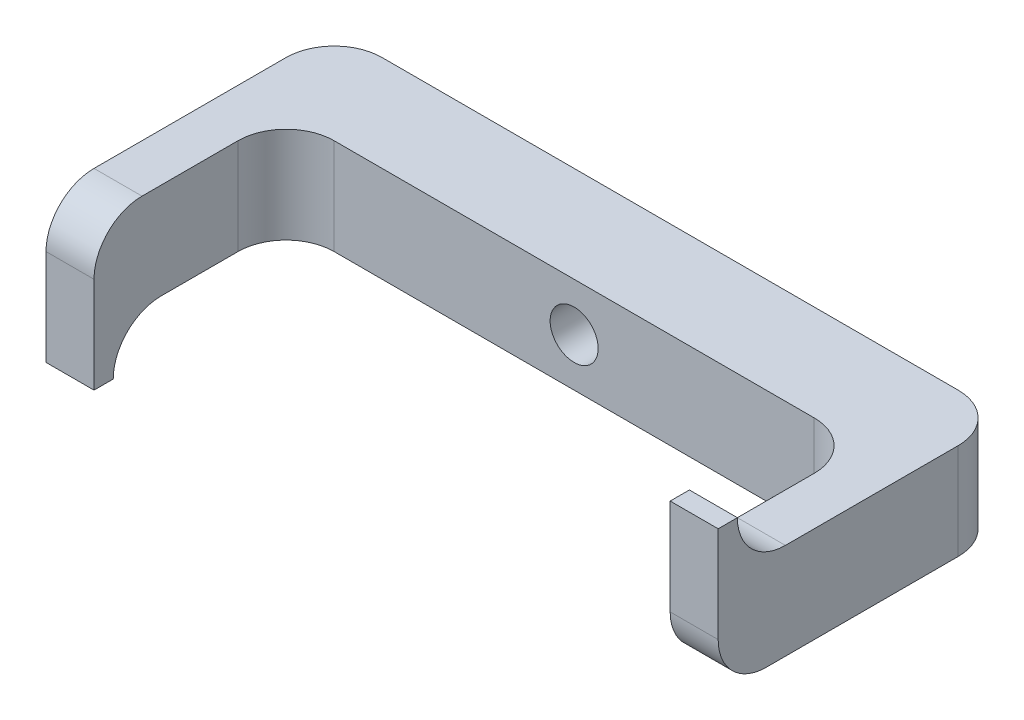
ISO-10303-21;
HEADER;
FILE_DESCRIPTION(('STEP AP214'),'2;1');
FILE_NAME('part.step','',(''),(''),'','','');
FILE_SCHEMA(('AUTOMOTIVE_DESIGN { 1 0 10303 214 1 1 1 1 }'));
ENDSEC;
DATA;
#1=APPLICATION_CONTEXT('core data for automotive mechanical design processes');
#2=APPLICATION_PROTOCOL_DEFINITION('international standard','automotive_design',2000,#1);
#3=PRODUCT_CONTEXT('',#1,'mechanical');
#4=PRODUCT('Part','Part','',(#3));
#5=PRODUCT_RELATED_PRODUCT_CATEGORY('part','',(#4));
#6=PRODUCT_DEFINITION_FORMATION('','',#4);
#7=PRODUCT_DEFINITION_CONTEXT('part definition',#1,'design');
#8=PRODUCT_DEFINITION('design','',#6,#7);
#9=PRODUCT_DEFINITION_SHAPE('','',#8);
#10=(LENGTH_UNIT() NAMED_UNIT(*) SI_UNIT(.MILLI.,.METRE.));
#11=(NAMED_UNIT(*) PLANE_ANGLE_UNIT() SI_UNIT($,.RADIAN.));
#12=(NAMED_UNIT(*) SI_UNIT($,.STERADIAN.) SOLID_ANGLE_UNIT());
#13=UNCERTAINTY_MEASURE_WITH_UNIT(LENGTH_MEASURE(1.E-05),#10,'distance_accuracy_value','');
#14=(GEOMETRIC_REPRESENTATION_CONTEXT(3) GLOBAL_UNCERTAINTY_ASSIGNED_CONTEXT((#13)) GLOBAL_UNIT_ASSIGNED_CONTEXT((#10,
#11,#12)) REPRESENTATION_CONTEXT('',''));
#15=CARTESIAN_POINT('',(0.,0.,0.));
#16=DIRECTION('',(0.,0.,1.));
#17=DIRECTION('',(1.,0.,0.));
#18=AXIS2_PLACEMENT_3D('',#15,#16,#17);
#19=CARTESIAN_POINT('',(-35.,5.,15.));
#20=DIRECTION('',(1.,0.,0.));
#21=DIRECTION('',(0.,0.,-1.));
#22=AXIS2_PLACEMENT_3D('',#19,#20,#21);
#23=PLANE('',#22);
#24=DIRECTION('',(0.,-1.,0.));
#25=VECTOR('',#24,1.);
#26=CARTESIAN_POINT('',(-35.,5.,15.));
#27=LINE('',#26,#25);
#28=CARTESIAN_POINT('',(-35.,0.,15.));
#29=VERTEX_POINT('',#28);
#30=CARTESIAN_POINT('',(-35.,-10.,15.));
#31=VERTEX_POINT('',#30);
#32=EDGE_CURVE('E279',#29,#31,#27,.T.);
#33=ORIENTED_EDGE('',*,*,#32,.F.);
#34=CARTESIAN_POINT('',(-35.,0.,10.));
#35=DIRECTION('',(1.,0.,0.));
#36=DIRECTION('',(0.,0.,-1.));
#37=AXIS2_PLACEMENT_3D('',#34,#35,#36);
#38=CIRCLE('',#37,5.);
#39=CARTESIAN_POINT('',(-35.,5.,10.));
#40=VERTEX_POINT('',#39);
#41=EDGE_CURVE('E320',#29,#40,#38,.F.);
#42=ORIENTED_EDGE('',*,*,#41,.T.);
#43=DIRECTION('',(0.,0.,1.));
#44=VECTOR('',#43,1.);
#45=CARTESIAN_POINT('',(-35.,5.,15.));
#46=LINE('',#45,#44);
#47=CARTESIAN_POINT('',(-35.,5.,-10.));
#48=VERTEX_POINT('',#47);
#49=EDGE_CURVE('E226',#48,#40,#46,.T.);
#50=ORIENTED_EDGE('',*,*,#49,.F.);
#51=DIRECTION('',(0.,-1.,0.));
#52=VECTOR('',#51,1.);
#53=CARTESIAN_POINT('',(-35.,5.,-10.));
#54=LINE('',#53,#52);
#55=CARTESIAN_POINT('',(-35.,-5.,-10.));
#56=VERTEX_POINT('',#55);
#57=EDGE_CURVE('E316',#48,#56,#54,.T.);
#58=ORIENTED_EDGE('',*,*,#57,.T.);
#59=DIRECTION('',(0.,0.,1.));
#60=VECTOR('',#59,1.);
#61=CARTESIAN_POINT('',(-35.,-5.,15.));
#62=LINE('',#61,#60);
#63=CARTESIAN_POINT('',(-35.,-5.,8.));
#64=VERTEX_POINT('',#63);
#65=EDGE_CURVE('E222',#56,#64,#62,.T.);
#66=ORIENTED_EDGE('',*,*,#65,.T.);
#67=CARTESIAN_POINT('',(-35.,-10.,8.));
#68=DIRECTION('',(1.,0.,0.));
#69=DIRECTION('',(0.,0.,-1.));
#70=AXIS2_PLACEMENT_3D('',#67,#68,#69);
#71=CIRCLE('',#70,5.);
#72=CARTESIAN_POINT('',(-35.,-10.,13.));
#73=VERTEX_POINT('',#72);
#74=EDGE_CURVE('E180',#64,#73,#71,.T.);
#75=ORIENTED_EDGE('',*,*,#74,.T.);
#76=DIRECTION('',(0.,0.,1.));
#77=VECTOR('',#76,1.);
#78=CARTESIAN_POINT('',(-35.,-10.,13.));
#79=LINE('',#78,#77);
#80=EDGE_CURVE('E206',#73,#31,#79,.T.);
#81=ORIENTED_EDGE('',*,*,#80,.T.);
#82=EDGE_LOOP('',(#33,#42,#50,#58,#66,#75,#81));
#83=FACE_BOUND('',#82,.T.);
#84=ADVANCED_FACE('F39',(#83),#23,.F.);
#85=CARTESIAN_POINT('',(-30.,5.,15.));
#86=DIRECTION('',(0.,0.,-1.));
#87=DIRECTION('',(-1.,0.,0.));
#88=AXIS2_PLACEMENT_3D('',#85,#86,#87);
#89=PLANE('',#88);
#90=DIRECTION('',(0.,-1.,0.));
#91=VECTOR('',#90,1.);
#92=CARTESIAN_POINT('',(-30.,5.,15.));
#93=LINE('',#92,#91);
#94=CARTESIAN_POINT('',(-30.,0.,15.));
#95=VERTEX_POINT('',#94);
#96=CARTESIAN_POINT('',(-30.,-10.,15.));
#97=VERTEX_POINT('',#96);
#98=EDGE_CURVE('E276',#95,#97,#93,.T.);
#99=ORIENTED_EDGE('',*,*,#98,.F.);
#100=DIRECTION('',(1.,0.,0.));
#101=VECTOR('',#100,1.);
#102=CARTESIAN_POINT('',(-30.,0.,15.));
#103=LINE('',#102,#101);
#104=EDGE_CURVE('E313',#95,#29,#103,.F.);
#105=ORIENTED_EDGE('',*,*,#104,.T.);
#106=ORIENTED_EDGE('',*,*,#32,.T.);
#107=DIRECTION('',(1.,0.,0.));
#108=VECTOR('',#107,1.);
#109=CARTESIAN_POINT('',(-35.,-10.,15.));
#110=LINE('',#109,#108);
#111=EDGE_CURVE('E200',#31,#97,#110,.T.);
#112=ORIENTED_EDGE('',*,*,#111,.T.);
#113=EDGE_LOOP('',(#99,#105,#106,#112));
#114=FACE_BOUND('',#113,.T.);
#115=ADVANCED_FACE('F409',(#114),#89,.F.);
#116=CARTESIAN_POINT('',(-30.,5.,-5.));
#117=DIRECTION('',(-1.,0.,0.));
#118=DIRECTION('',(0.,0.,1.));
#119=AXIS2_PLACEMENT_3D('',#116,#117,#118);
#120=PLANE('',#119);
#121=DIRECTION('',(0.,0.,-1.));
#122=VECTOR('',#121,1.);
#123=CARTESIAN_POINT('',(-30.,5.,-5.));
#124=LINE('',#123,#122);
#125=CARTESIAN_POINT('',(-30.,5.,10.));
#126=VERTEX_POINT('',#125);
#127=CARTESIAN_POINT('',(-30.,5.,0.));
#128=VERTEX_POINT('',#127);
#129=EDGE_CURVE('E230',#126,#128,#124,.T.);
#130=ORIENTED_EDGE('',*,*,#129,.F.);
#131=CARTESIAN_POINT('',(-30.,0.,10.));
#132=DIRECTION('',(-1.,0.,0.));
#133=DIRECTION('',(0.,0.,1.));
#134=AXIS2_PLACEMENT_3D('',#131,#132,#133);
#135=CIRCLE('',#134,5.);
#136=EDGE_CURVE('E310',#126,#95,#135,.F.);
#137=ORIENTED_EDGE('',*,*,#136,.T.);
#138=ORIENTED_EDGE('',*,*,#98,.T.);
#139=DIRECTION('',(0.,0.,1.));
#140=VECTOR('',#139,1.);
#141=CARTESIAN_POINT('',(-30.,-10.,13.));
#142=LINE('',#141,#140);
#143=CARTESIAN_POINT('',(-30.,-10.,13.));
#144=VERTEX_POINT('',#143);
#145=EDGE_CURVE('E210',#144,#97,#142,.T.);
#146=ORIENTED_EDGE('',*,*,#145,.F.);
#147=CARTESIAN_POINT('',(-30.,-10.,8.));
#148=DIRECTION('',(-1.,0.,0.));
#149=DIRECTION('',(0.,0.,1.));
#150=AXIS2_PLACEMENT_3D('',#147,#148,#149);
#151=CIRCLE('',#150,5.);
#152=CARTESIAN_POINT('',(-30.,-5.,8.));
#153=VERTEX_POINT('',#152);
#154=EDGE_CURVE('E351',#144,#153,#151,.T.);
#155=ORIENTED_EDGE('',*,*,#154,.T.);
#156=DIRECTION('',(0.,0.,-1.));
#157=VECTOR('',#156,1.);
#158=CARTESIAN_POINT('',(-30.,-5.,-5.));
#159=LINE('',#158,#157);
#160=CARTESIAN_POINT('',(-30.,-5.,0.));
#161=VERTEX_POINT('',#160);
#162=EDGE_CURVE('E253',#153,#161,#159,.T.);
#163=ORIENTED_EDGE('',*,*,#162,.T.);
#164=DIRECTION('',(0.,-1.,0.));
#165=VECTOR('',#164,1.);
#166=CARTESIAN_POINT('',(-30.,5.,0.));
#167=LINE('',#166,#165);
#168=EDGE_CURVE('E307',#161,#128,#167,.F.);
#169=ORIENTED_EDGE('',*,*,#168,.T.);
#170=EDGE_LOOP('',(#130,#137,#138,#146,#155,#163,#169));
#171=FACE_BOUND('',#170,.T.);
#172=ADVANCED_FACE('F374',(#171),#120,.F.);
#173=CARTESIAN_POINT('',(30.,5.,-5.));
#174=DIRECTION('',(0.,0.,-1.));
#175=DIRECTION('',(-1.,0.,0.));
#176=AXIS2_PLACEMENT_3D('',#173,#174,#175);
#177=PLANE('',#176);
#178=CARTESIAN_POINT('',(0.,0.,-5.));
#179=DIRECTION('',(0.,0.,1.));
#180=DIRECTION('',(1.,0.,0.));
#181=AXIS2_PLACEMENT_3D('',#178,#179,#180);
#182=CIRCLE('',#181,2.5);
#183=CARTESIAN_POINT('',(2.5,0.,-5.));
#184=VERTEX_POINT('',#183);
#185=EDGE_CURVE('E214',#184,#184,#182,.T.);
#186=ORIENTED_EDGE('',*,*,#185,.F.);
#187=EDGE_LOOP('',(#186));
#188=FACE_BOUND('',#187,.T.);
#189=DIRECTION('',(1.,0.,0.));
#190=VECTOR('',#189,1.);
#191=CARTESIAN_POINT('',(30.,-5.,-5.));
#192=LINE('',#191,#190);
#193=CARTESIAN_POINT('',(-25.,-5.,-5.));
#194=VERTEX_POINT('',#193);
#195=CARTESIAN_POINT('',(25.,-5.,-5.));
#196=VERTEX_POINT('',#195);
#197=EDGE_CURVE('E257',#194,#196,#192,.T.);
#198=ORIENTED_EDGE('',*,*,#197,.T.);
#199=DIRECTION('',(0.,-1.,0.));
#200=VECTOR('',#199,1.);
#201=CARTESIAN_POINT('',(25.,5.,-5.));
#202=LINE('',#201,#200);
#203=CARTESIAN_POINT('',(25.,5.,-5.));
#204=VERTEX_POINT('',#203);
#205=EDGE_CURVE('E348',#196,#204,#202,.F.);
#206=ORIENTED_EDGE('',*,*,#205,.T.);
#207=DIRECTION('',(1.,0.,0.));
#208=VECTOR('',#207,1.);
#209=CARTESIAN_POINT('',(30.,5.,-5.));
#210=LINE('',#209,#208);
#211=CARTESIAN_POINT('',(-25.,5.,-5.));
#212=VERTEX_POINT('',#211);
#213=EDGE_CURVE('E235',#212,#204,#210,.T.);
#214=ORIENTED_EDGE('',*,*,#213,.F.);
#215=DIRECTION('',(0.,-1.,0.));
#216=VECTOR('',#215,1.);
#217=CARTESIAN_POINT('',(-25.,-5.,-5.));
#218=LINE('',#217,#216);
#219=EDGE_CURVE('E344',#212,#194,#218,.T.);
#220=ORIENTED_EDGE('',*,*,#219,.T.);
#221=EDGE_LOOP('',(#198,#206,#214,#220));
#222=FACE_BOUND('',#221,.T.);
#223=ADVANCED_FACE('F382',(#188,#222),#177,.F.);
#224=CARTESIAN_POINT('',(30.,5.,15.));
#225=DIRECTION('',(1.,0.,0.));
#226=DIRECTION('',(0.,0.,-1.));
#227=AXIS2_PLACEMENT_3D('',#224,#225,#226);
#228=PLANE('',#227);
#229=DIRECTION('',(0.,0.,1.));
#230=VECTOR('',#229,1.);
#231=CARTESIAN_POINT('',(30.,-5.,15.));
#232=LINE('',#231,#230);
#233=CARTESIAN_POINT('',(30.,-5.,0.));
#234=VERTEX_POINT('',#233);
#235=CARTESIAN_POINT('',(30.,-5.,10.));
#236=VERTEX_POINT('',#235);
#237=EDGE_CURVE('E261',#234,#236,#232,.T.);
#238=ORIENTED_EDGE('',*,*,#237,.T.);
#239=CARTESIAN_POINT('',(30.,0.,10.));
#240=DIRECTION('',(1.,0.,0.));
#241=DIRECTION('',(0.,0.,-1.));
#242=AXIS2_PLACEMENT_3D('',#239,#240,#241);
#243=CIRCLE('',#242,5.);
#244=CARTESIAN_POINT('',(30.,0.,15.));
#245=VERTEX_POINT('',#244);
#246=EDGE_CURVE('E55',#236,#245,#243,.F.);
#247=ORIENTED_EDGE('',*,*,#246,.T.);
#248=DIRECTION('',(0.,-1.,0.));
#249=VECTOR('',#248,1.);
#250=CARTESIAN_POINT('',(30.,5.,15.));
#251=LINE('',#250,#249);
#252=CARTESIAN_POINT('',(30.,10.,15.));
#253=VERTEX_POINT('',#252);
#254=EDGE_CURVE('E273',#253,#245,#251,.T.);
#255=ORIENTED_EDGE('',*,*,#254,.F.);
#256=DIRECTION('',(0.,0.,1.));
#257=VECTOR('',#256,1.);
#258=CARTESIAN_POINT('',(30.,10.,13.));
#259=LINE('',#258,#257);
#260=CARTESIAN_POINT('',(30.,10.,13.));
#261=VERTEX_POINT('',#260);
#262=EDGE_CURVE('E191',#261,#253,#259,.T.);
#263=ORIENTED_EDGE('',*,*,#262,.F.);
#264=CARTESIAN_POINT('',(30.,10.,8.));
#265=DIRECTION('',(1.,0.,0.));
#266=DIRECTION('',(0.,0.,-1.));
#267=AXIS2_PLACEMENT_3D('',#264,#265,#266);
#268=CIRCLE('',#267,5.);
#269=CARTESIAN_POINT('',(30.,5.,8.));
#270=VERTEX_POINT('',#269);
#271=EDGE_CURVE('E179',#261,#270,#268,.T.);
#272=ORIENTED_EDGE('',*,*,#271,.T.);
#273=DIRECTION('',(0.,0.,1.));
#274=VECTOR('',#273,1.);
#275=CARTESIAN_POINT('',(30.,5.,15.));
#276=LINE('',#275,#274);
#277=CARTESIAN_POINT('',(30.,5.,0.));
#278=VERTEX_POINT('',#277);
#279=EDGE_CURVE('E239',#278,#270,#276,.T.);
#280=ORIENTED_EDGE('',*,*,#279,.F.);
#281=DIRECTION('',(0.,-1.,0.));
#282=VECTOR('',#281,1.);
#283=CARTESIAN_POINT('',(30.,-5.,0.));
#284=LINE('',#283,#282);
#285=EDGE_CURVE('E331',#278,#234,#284,.T.);
#286=ORIENTED_EDGE('',*,*,#285,.T.);
#287=EDGE_LOOP('',(#238,#247,#255,#263,#272,#280,#286));
#288=FACE_BOUND('',#287,.T.);
#289=ADVANCED_FACE('F388',(#288),#228,.F.);
#290=CARTESIAN_POINT('',(35.,5.,15.));
#291=DIRECTION('',(0.,0.,-1.));
#292=DIRECTION('',(-1.,0.,0.));
#293=AXIS2_PLACEMENT_3D('',#290,#291,#292);
#294=PLANE('',#293);
#295=ORIENTED_EDGE('',*,*,#254,.T.);
#296=DIRECTION('',(1.,0.,0.));
#297=VECTOR('',#296,1.);
#298=CARTESIAN_POINT('',(35.,0.,15.));
#299=LINE('',#298,#297);
#300=CARTESIAN_POINT('',(35.,0.,15.));
#301=VERTEX_POINT('',#300);
#302=EDGE_CURVE('E323',#245,#301,#299,.T.);
#303=ORIENTED_EDGE('',*,*,#302,.T.);
#304=DIRECTION('',(0.,-1.,0.));
#305=VECTOR('',#304,1.);
#306=CARTESIAN_POINT('',(35.,5.,15.));
#307=LINE('',#306,#305);
#308=CARTESIAN_POINT('',(35.,10.,15.));
#309=VERTEX_POINT('',#308);
#310=EDGE_CURVE('E249',#309,#301,#307,.T.);
#311=ORIENTED_EDGE('',*,*,#310,.F.);
#312=DIRECTION('',(-1.,0.,0.));
#313=VECTOR('',#312,1.);
#314=CARTESIAN_POINT('',(35.,10.,15.));
#315=LINE('',#314,#313);
#316=EDGE_CURVE('E189',#309,#253,#315,.T.);
#317=ORIENTED_EDGE('',*,*,#316,.T.);
#318=EDGE_LOOP('',(#295,#303,#311,#317));
#319=FACE_BOUND('',#318,.T.);
#320=ADVANCED_FACE('F391',(#319),#294,.F.);
#321=CARTESIAN_POINT('',(35.,5.,-15.));
#322=DIRECTION('',(-1.,0.,0.));
#323=DIRECTION('',(0.,0.,1.));
#324=AXIS2_PLACEMENT_3D('',#321,#322,#323);
#325=PLANE('',#324);
#326=ORIENTED_EDGE('',*,*,#310,.T.);
#327=CARTESIAN_POINT('',(35.,0.,10.));
#328=DIRECTION('',(-1.,0.,0.));
#329=DIRECTION('',(0.,0.,1.));
#330=AXIS2_PLACEMENT_3D('',#327,#328,#329);
#331=CIRCLE('',#330,5.);
#332=CARTESIAN_POINT('',(35.,-5.,10.));
#333=VERTEX_POINT('',#332);
#334=EDGE_CURVE('E63',#301,#333,#331,.F.);
#335=ORIENTED_EDGE('',*,*,#334,.T.);
#336=DIRECTION('',(0.,0.,-1.));
#337=VECTOR('',#336,1.);
#338=CARTESIAN_POINT('',(35.,-5.,-15.));
#339=LINE('',#338,#337);
#340=CARTESIAN_POINT('',(35.,-5.,-10.));
#341=VERTEX_POINT('',#340);
#342=EDGE_CURVE('E264',#333,#341,#339,.T.);
#343=ORIENTED_EDGE('',*,*,#342,.T.);
#344=DIRECTION('',(0.,-1.,0.));
#345=VECTOR('',#344,1.);
#346=CARTESIAN_POINT('',(35.,5.,-10.));
#347=LINE('',#346,#345);
#348=CARTESIAN_POINT('',(35.,5.,-10.));
#349=VERTEX_POINT('',#348);
#350=EDGE_CURVE('E326',#341,#349,#347,.F.);
#351=ORIENTED_EDGE('',*,*,#350,.T.);
#352=DIRECTION('',(0.,0.,-1.));
#353=VECTOR('',#352,1.);
#354=CARTESIAN_POINT('',(35.,5.,-15.));
#355=LINE('',#354,#353);
#356=CARTESIAN_POINT('',(35.,5.,8.));
#357=VERTEX_POINT('',#356);
#358=EDGE_CURVE('E173',#357,#349,#355,.T.);
#359=ORIENTED_EDGE('',*,*,#358,.F.);
#360=CARTESIAN_POINT('',(35.,10.,8.));
#361=DIRECTION('',(-1.,0.,0.));
#362=DIRECTION('',(0.,0.,1.));
#363=AXIS2_PLACEMENT_3D('',#360,#361,#362);
#364=CIRCLE('',#363,5.);
#365=CARTESIAN_POINT('',(35.,10.,13.));
#366=VERTEX_POINT('',#365);
#367=EDGE_CURVE('E166',#357,#366,#364,.T.);
#368=ORIENTED_EDGE('',*,*,#367,.T.);
#369=DIRECTION('',(0.,0.,1.));
#370=VECTOR('',#369,1.);
#371=CARTESIAN_POINT('',(35.,10.,13.));
#372=LINE('',#371,#370);
#373=EDGE_CURVE('E170',#366,#309,#372,.T.);
#374=ORIENTED_EDGE('',*,*,#373,.T.);
#375=EDGE_LOOP('',(#326,#335,#343,#351,#359,#368,#374));
#376=FACE_BOUND('',#375,.T.);
#377=ADVANCED_FACE('F169',(#376),#325,.F.);
#378=CARTESIAN_POINT('',(-35.,5.,-15.));
#379=DIRECTION('',(0.,0.,1.));
#380=DIRECTION('',(1.,0.,0.));
#381=AXIS2_PLACEMENT_3D('',#378,#379,#380);
#382=PLANE('',#381);
#383=CARTESIAN_POINT('',(0.,0.,-15.));
#384=DIRECTION('',(0.,0.,1.));
#385=DIRECTION('',(1.,0.,0.));
#386=AXIS2_PLACEMENT_3D('',#383,#384,#385);
#387=CIRCLE('',#386,2.5);
#388=CARTESIAN_POINT('',(2.5,0.,-15.));
#389=VERTEX_POINT('',#388);
#390=EDGE_CURVE('E218',#389,#389,#387,.T.);
#391=ORIENTED_EDGE('',*,*,#390,.T.);
#392=EDGE_LOOP('',(#391));
#393=FACE_BOUND('',#392,.T.);
#394=DIRECTION('',(-1.,0.,0.));
#395=VECTOR('',#394,1.);
#396=CARTESIAN_POINT('',(-35.,-5.,-15.));
#397=LINE('',#396,#395);
#398=CARTESIAN_POINT('',(30.,-5.,-15.));
#399=VERTEX_POINT('',#398);
#400=CARTESIAN_POINT('',(-30.,-5.,-15.));
#401=VERTEX_POINT('',#400);
#402=EDGE_CURVE('E231',#399,#401,#397,.T.);
#403=ORIENTED_EDGE('',*,*,#402,.T.);
#404=DIRECTION('',(0.,-1.,0.));
#405=VECTOR('',#404,1.);
#406=CARTESIAN_POINT('',(-30.,5.,-15.));
#407=LINE('',#406,#405);
#408=CARTESIAN_POINT('',(-30.,5.,-15.));
#409=VERTEX_POINT('',#408);
#410=EDGE_CURVE('E341',#401,#409,#407,.F.);
#411=ORIENTED_EDGE('',*,*,#410,.T.);
#412=DIRECTION('',(-1.,0.,0.));
#413=VECTOR('',#412,1.);
#414=CARTESIAN_POINT('',(-35.,5.,-15.));
#415=LINE('',#414,#413);
#416=CARTESIAN_POINT('',(30.,5.,-15.));
#417=VERTEX_POINT('',#416);
#418=EDGE_CURVE('E245',#417,#409,#415,.T.);
#419=ORIENTED_EDGE('',*,*,#418,.F.);
#420=DIRECTION('',(0.,-1.,0.));
#421=VECTOR('',#420,1.);
#422=CARTESIAN_POINT('',(30.,5.,-15.));
#423=LINE('',#422,#421);
#424=EDGE_CURVE('E337',#417,#399,#423,.T.);
#425=ORIENTED_EDGE('',*,*,#424,.T.);
#426=EDGE_LOOP('',(#403,#411,#419,#425));
#427=FACE_BOUND('',#426,.T.);
#428=ADVANCED_FACE('F457',(#393,#427),#382,.F.);
#429=CARTESIAN_POINT('',(0.,5.,0.));
#430=DIRECTION('',(0.,-1.,0.));
#431=DIRECTION('',(0.,0.,-1.));
#432=AXIS2_PLACEMENT_3D('',#429,#430,#431);
#433=PLANE('',#432);
#434=ORIENTED_EDGE('',*,*,#49,.T.);
#435=DIRECTION('',(1.,0.,0.));
#436=VECTOR('',#435,1.);
#437=CARTESIAN_POINT('',(0.,5.,10.));
#438=LINE('',#437,#436);
#439=EDGE_CURVE('E303',#40,#126,#438,.T.);
#440=ORIENTED_EDGE('',*,*,#439,.T.);
#441=ORIENTED_EDGE('',*,*,#129,.T.);
#442=CARTESIAN_POINT('',(-25.,5.,0.));
#443=DIRECTION('',(0.,-1.,0.));
#444=DIRECTION('',(0.,0.,-1.));
#445=AXIS2_PLACEMENT_3D('',#442,#443,#444);
#446=CIRCLE('',#445,5.);
#447=EDGE_CURVE('E11',#128,#212,#446,.T.);
#448=ORIENTED_EDGE('',*,*,#447,.T.);
#449=ORIENTED_EDGE('',*,*,#213,.T.);
#450=CARTESIAN_POINT('',(25.,5.,0.));
#451=DIRECTION('',(0.,-1.,0.));
#452=DIRECTION('',(0.,0.,-1.));
#453=AXIS2_PLACEMENT_3D('',#450,#451,#452);
#454=CIRCLE('',#453,5.);
#455=EDGE_CURVE('E361',#204,#278,#454,.T.);
#456=ORIENTED_EDGE('',*,*,#455,.T.);
#457=ORIENTED_EDGE('',*,*,#279,.T.);
#458=DIRECTION('',(1.,0.,0.));
#459=VECTOR('',#458,1.);
#460=CARTESIAN_POINT('',(0.,5.,8.));
#461=LINE('',#460,#459);
#462=EDGE_CURVE('E300',#270,#357,#461,.T.);
#463=ORIENTED_EDGE('',*,*,#462,.T.);
#464=ORIENTED_EDGE('',*,*,#358,.T.);
#465=CARTESIAN_POINT('',(30.,5.,-10.));
#466=DIRECTION('',(0.,-1.,0.));
#467=DIRECTION('',(0.,0.,-1.));
#468=AXIS2_PLACEMENT_3D('',#465,#466,#467);
#469=CIRCLE('',#468,5.);
#470=EDGE_CURVE('E294',#349,#417,#469,.F.);
#471=ORIENTED_EDGE('',*,*,#470,.T.);
#472=ORIENTED_EDGE('',*,*,#418,.T.);
#473=CARTESIAN_POINT('',(-30.,5.,-10.));
#474=DIRECTION('',(0.,-1.,0.));
#475=DIRECTION('',(0.,0.,-1.));
#476=AXIS2_PLACEMENT_3D('',#473,#474,#475);
#477=CIRCLE('',#476,5.);
#478=EDGE_CURVE('E297',#409,#48,#477,.F.);
#479=ORIENTED_EDGE('',*,*,#478,.T.);
#480=EDGE_LOOP('',(#434,#440,#441,#448,#449,#456,#457,#463,#464,#471,#472,#479));
#481=FACE_BOUND('',#480,.T.);
#482=ADVANCED_FACE('F379',(#481),#433,.F.);
#483=CARTESIAN_POINT('',(0.,-5.,0.));
#484=DIRECTION('',(0.,-1.,0.));
#485=DIRECTION('',(0.,0.,-1.));
#486=AXIS2_PLACEMENT_3D('',#483,#484,#485);
#487=PLANE('',#486);
#488=ORIENTED_EDGE('',*,*,#162,.F.);
#489=DIRECTION('',(1.,0.,0.));
#490=VECTOR('',#489,1.);
#491=CARTESIAN_POINT('',(-35.,-5.,8.));
#492=LINE('',#491,#490);
#493=EDGE_CURVE('E291',#153,#64,#492,.F.);
#494=ORIENTED_EDGE('',*,*,#493,.T.);
#495=ORIENTED_EDGE('',*,*,#65,.F.);
#496=CARTESIAN_POINT('',(-30.,-5.,-10.));
#497=DIRECTION('',(0.,-1.,0.));
#498=DIRECTION('',(0.,0.,-1.));
#499=AXIS2_PLACEMENT_3D('',#496,#497,#498);
#500=CIRCLE('',#499,5.);
#501=EDGE_CURVE('E285',#56,#401,#500,.T.);
#502=ORIENTED_EDGE('',*,*,#501,.T.);
#503=ORIENTED_EDGE('',*,*,#402,.F.);
#504=CARTESIAN_POINT('',(30.,-5.,-10.));
#505=DIRECTION('',(0.,-1.,0.));
#506=DIRECTION('',(0.,0.,-1.));
#507=AXIS2_PLACEMENT_3D('',#504,#505,#506);
#508=CIRCLE('',#507,5.);
#509=EDGE_CURVE('E282',#399,#341,#508,.T.);
#510=ORIENTED_EDGE('',*,*,#509,.T.);
#511=ORIENTED_EDGE('',*,*,#342,.F.);
#512=DIRECTION('',(1.,0.,0.));
#513=VECTOR('',#512,1.);
#514=CARTESIAN_POINT('',(30.,-5.,10.));
#515=LINE('',#514,#513);
#516=EDGE_CURVE('E288',#333,#236,#515,.F.);
#517=ORIENTED_EDGE('',*,*,#516,.T.);
#518=ORIENTED_EDGE('',*,*,#237,.F.);
#519=CARTESIAN_POINT('',(25.,-5.,0.));
#520=DIRECTION('',(0.,-1.,0.));
#521=DIRECTION('',(0.,0.,-1.));
#522=AXIS2_PLACEMENT_3D('',#519,#520,#521);
#523=CIRCLE('',#522,5.);
#524=EDGE_CURVE('E358',#234,#196,#523,.F.);
#525=ORIENTED_EDGE('',*,*,#524,.T.);
#526=ORIENTED_EDGE('',*,*,#197,.F.);
#527=CARTESIAN_POINT('',(-25.,-5.,0.));
#528=DIRECTION('',(0.,-1.,0.));
#529=DIRECTION('',(0.,0.,-1.));
#530=AXIS2_PLACEMENT_3D('',#527,#528,#529);
#531=CIRCLE('',#530,5.);
#532=EDGE_CURVE('E48',#194,#161,#531,.F.);
#533=ORIENTED_EDGE('',*,*,#532,.T.);
#534=EDGE_LOOP('',(#488,#494,#495,#502,#503,#510,#511,#517,#518,#525,#526,#533));
#535=FACE_BOUND('',#534,.T.);
#536=ADVANCED_FACE('F367',(#535),#487,.T.);
#537=CARTESIAN_POINT('',(0.,0.,-15.));
#538=DIRECTION('',(0.,0.,1.));
#539=DIRECTION('',(1.,0.,0.));
#540=AXIS2_PLACEMENT_3D('',#537,#538,#539);
#541=CYLINDRICAL_SURFACE('',#540,2.5);
#542=ORIENTED_EDGE('',*,*,#390,.F.);
#543=EDGE_LOOP('',(#542));
#544=FACE_BOUND('',#543,.T.);
#545=ORIENTED_EDGE('',*,*,#185,.T.);
#546=EDGE_LOOP('',(#545));
#547=FACE_BOUND('',#546,.T.);
#548=ADVANCED_FACE('F445',(#544,#547),#541,.F.);
#549=CARTESIAN_POINT('',(-35.,-10.,13.));
#550=DIRECTION('',(0.,-1.,0.));
#551=DIRECTION('',(1.,0.,0.));
#552=AXIS2_PLACEMENT_3D('',#549,#550,#551);
#553=PLANE('',#552);
#554=ORIENTED_EDGE('',*,*,#111,.F.);
#555=ORIENTED_EDGE('',*,*,#80,.F.);
#556=DIRECTION('',(1.,0.,0.));
#557=VECTOR('',#556,1.);
#558=CARTESIAN_POINT('',(-35.,-10.,13.));
#559=LINE('',#558,#557);
#560=EDGE_CURVE('E202',#73,#144,#559,.T.);
#561=ORIENTED_EDGE('',*,*,#560,.T.);
#562=ORIENTED_EDGE('',*,*,#145,.T.);
#563=EDGE_LOOP('',(#554,#555,#561,#562));
#564=FACE_BOUND('',#563,.T.);
#565=ADVANCED_FACE('F442',(#564),#553,.T.);
#566=CARTESIAN_POINT('',(35.,10.,13.));
#567=DIRECTION('',(0.,1.,0.));
#568=DIRECTION('',(0.,0.,1.));
#569=AXIS2_PLACEMENT_3D('',#566,#567,#568);
#570=PLANE('',#569);
#571=ORIENTED_EDGE('',*,*,#316,.F.);
#572=ORIENTED_EDGE('',*,*,#373,.F.);
#573=DIRECTION('',(-1.,0.,0.));
#574=VECTOR('',#573,1.);
#575=CARTESIAN_POINT('',(35.,10.,13.));
#576=LINE('',#575,#574);
#577=EDGE_CURVE('E186',#366,#261,#576,.T.);
#578=ORIENTED_EDGE('',*,*,#577,.T.);
#579=ORIENTED_EDGE('',*,*,#262,.T.);
#580=EDGE_LOOP('',(#571,#572,#578,#579));
#581=FACE_BOUND('',#580,.T.);
#582=ADVANCED_FACE('F184',(#581),#570,.T.);
#583=CARTESIAN_POINT('',(0.,-10.,8.));
#584=DIRECTION('',(-1.,0.,0.));
#585=DIRECTION('',(0.,0.,1.));
#586=AXIS2_PLACEMENT_3D('',#583,#584,#585);
#587=CYLINDRICAL_SURFACE('',#586,5.);
#588=ORIENTED_EDGE('',*,*,#74,.F.);
#589=ORIENTED_EDGE('',*,*,#493,.F.);
#590=ORIENTED_EDGE('',*,*,#154,.F.);
#591=ORIENTED_EDGE('',*,*,#560,.F.);
#592=EDGE_LOOP('',(#588,#589,#590,#591));
#593=FACE_BOUND('',#592,.T.);
#594=ADVANCED_FACE('F420',(#593),#587,.F.);
#595=CARTESIAN_POINT('',(0.,0.,10.));
#596=DIRECTION('',(1.,0.,0.));
#597=DIRECTION('',(0.,0.,-1.));
#598=AXIS2_PLACEMENT_3D('',#595,#596,#597);
#599=CYLINDRICAL_SURFACE('',#598,5.);
#600=ORIENTED_EDGE('',*,*,#41,.F.);
#601=ORIENTED_EDGE('',*,*,#104,.F.);
#602=ORIENTED_EDGE('',*,*,#136,.F.);
#603=ORIENTED_EDGE('',*,*,#439,.F.);
#604=EDGE_LOOP('',(#600,#601,#602,#603));
#605=FACE_BOUND('',#604,.T.);
#606=ADVANCED_FACE('F406',(#605),#599,.T.);
#607=CARTESIAN_POINT('',(0.,10.,8.));
#608=DIRECTION('',(1.,0.,0.));
#609=DIRECTION('',(0.,0.,-1.));
#610=AXIS2_PLACEMENT_3D('',#607,#608,#609);
#611=CYLINDRICAL_SURFACE('',#610,5.);
#612=ORIENTED_EDGE('',*,*,#271,.F.);
#613=ORIENTED_EDGE('',*,*,#577,.F.);
#614=ORIENTED_EDGE('',*,*,#367,.F.);
#615=ORIENTED_EDGE('',*,*,#462,.F.);
#616=EDGE_LOOP('',(#612,#613,#614,#615));
#617=FACE_BOUND('',#616,.T.);
#618=ADVANCED_FACE('F193',(#617),#611,.F.);
#619=CARTESIAN_POINT('',(35.,0.,10.));
#620=DIRECTION('',(-1.,0.,0.));
#621=DIRECTION('',(0.,0.,1.));
#622=AXIS2_PLACEMENT_3D('',#619,#620,#621);
#623=CYLINDRICAL_SURFACE('',#622,5.);
#624=ORIENTED_EDGE('',*,*,#246,.F.);
#625=ORIENTED_EDGE('',*,*,#516,.F.);
#626=ORIENTED_EDGE('',*,*,#334,.F.);
#627=ORIENTED_EDGE('',*,*,#302,.F.);
#628=EDGE_LOOP('',(#624,#625,#626,#627));
#629=FACE_BOUND('',#628,.T.);
#630=ADVANCED_FACE('F395',(#629),#623,.T.);
#631=CARTESIAN_POINT('',(-30.,5.,-10.));
#632=DIRECTION('',(0.,-1.,0.));
#633=DIRECTION('',(0.,0.,-1.));
#634=AXIS2_PLACEMENT_3D('',#631,#632,#633);
#635=CYLINDRICAL_SURFACE('',#634,5.);
#636=ORIENTED_EDGE('',*,*,#478,.F.);
#637=ORIENTED_EDGE('',*,*,#410,.F.);
#638=ORIENTED_EDGE('',*,*,#501,.F.);
#639=ORIENTED_EDGE('',*,*,#57,.F.);
#640=EDGE_LOOP('',(#636,#637,#638,#639));
#641=FACE_BOUND('',#640,.T.);
#642=ADVANCED_FACE('F397',(#641),#635,.T.);
#643=CARTESIAN_POINT('',(30.,5.,-10.));
#644=DIRECTION('',(0.,-1.,0.));
#645=DIRECTION('',(0.,0.,-1.));
#646=AXIS2_PLACEMENT_3D('',#643,#644,#645);
#647=CYLINDRICAL_SURFACE('',#646,5.);
#648=ORIENTED_EDGE('',*,*,#470,.F.);
#649=ORIENTED_EDGE('',*,*,#350,.F.);
#650=ORIENTED_EDGE('',*,*,#509,.F.);
#651=ORIENTED_EDGE('',*,*,#424,.F.);
#652=EDGE_LOOP('',(#648,#649,#650,#651));
#653=FACE_BOUND('',#652,.T.);
#654=ADVANCED_FACE('F403',(#653),#647,.T.);
#655=CARTESIAN_POINT('',(25.,5.,0.));
#656=DIRECTION('',(0.,1.,0.));
#657=DIRECTION('',(0.,0.,1.));
#658=AXIS2_PLACEMENT_3D('',#655,#656,#657);
#659=CYLINDRICAL_SURFACE('',#658,5.);
#660=ORIENTED_EDGE('',*,*,#455,.F.);
#661=ORIENTED_EDGE('',*,*,#205,.F.);
#662=ORIENTED_EDGE('',*,*,#524,.F.);
#663=ORIENTED_EDGE('',*,*,#285,.F.);
#664=EDGE_LOOP('',(#660,#661,#662,#663));
#665=FACE_BOUND('',#664,.T.);
#666=ADVANCED_FACE('F385',(#665),#659,.F.);
#667=CARTESIAN_POINT('',(-25.,5.,0.));
#668=DIRECTION('',(0.,1.,0.));
#669=DIRECTION('',(0.,0.,1.));
#670=AXIS2_PLACEMENT_3D('',#667,#668,#669);
#671=CYLINDRICAL_SURFACE('',#670,5.);
#672=ORIENTED_EDGE('',*,*,#447,.F.);
#673=ORIENTED_EDGE('',*,*,#168,.F.);
#674=ORIENTED_EDGE('',*,*,#532,.F.);
#675=ORIENTED_EDGE('',*,*,#219,.F.);
#676=EDGE_LOOP('',(#672,#673,#674,#675));
#677=FACE_BOUND('',#676,.T.);
#678=ADVANCED_FACE('F41',(#677),#671,.F.);
#679=CLOSED_SHELL('',(#84,#115,#172,#223,#289,#320,#377,#428,#482,#536,#548,#565,#582,#594,#606,
#618,#630,#642,#654,#666,#678));
#680=MANIFOLD_SOLID_BREP('B2',#679);
#681=ADVANCED_BREP_SHAPE_REPRESENTATION('',(#18,#680),#14);
#682=SHAPE_DEFINITION_REPRESENTATION(#9,#681);
ENDSEC;
END-ISO-10303-21;
